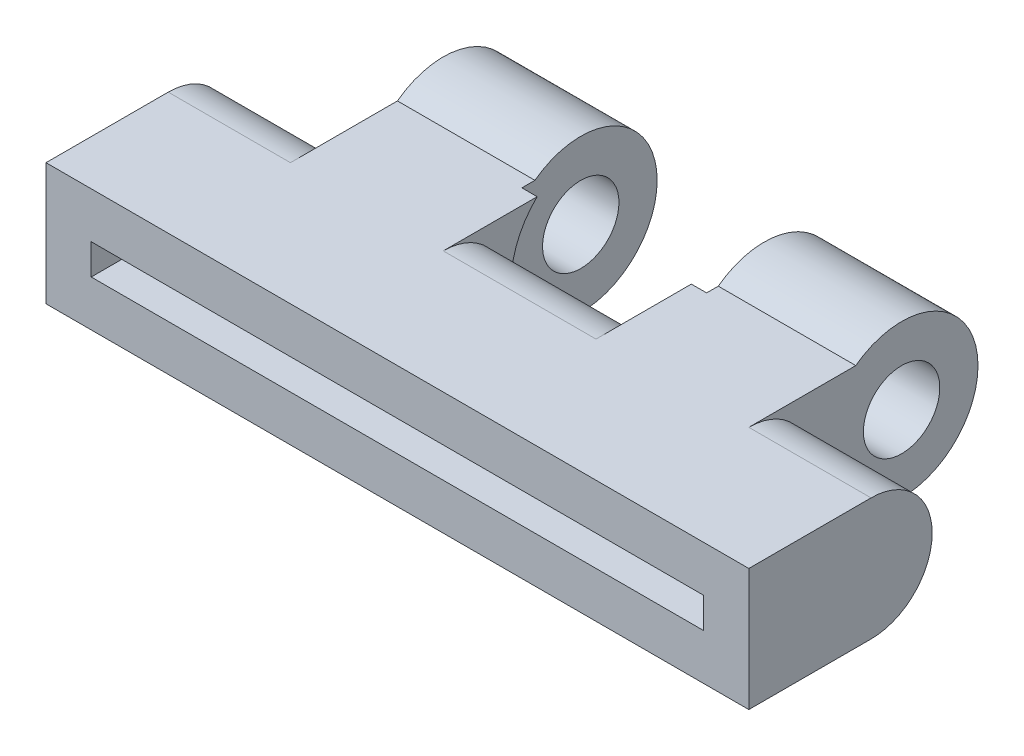
ISO-10303-21;
HEADER;
FILE_DESCRIPTION(('STEP AP214'),'2;1');
FILE_NAME('part.step','',(''),(''),'','','');
FILE_SCHEMA(('AUTOMOTIVE_DESIGN { 1 0 10303 214 1 1 1 1 }'));
ENDSEC;
DATA;
#1=APPLICATION_CONTEXT('core data for automotive mechanical design processes');
#2=APPLICATION_PROTOCOL_DEFINITION('international standard','automotive_design',2000,#1);
#3=PRODUCT_CONTEXT('',#1,'mechanical');
#4=PRODUCT('Part','Part','',(#3));
#5=PRODUCT_RELATED_PRODUCT_CATEGORY('part','',(#4));
#6=PRODUCT_DEFINITION_FORMATION('','',#4);
#7=PRODUCT_DEFINITION_CONTEXT('part definition',#1,'design');
#8=PRODUCT_DEFINITION('design','',#6,#7);
#9=PRODUCT_DEFINITION_SHAPE('','',#8);
#10=(LENGTH_UNIT() NAMED_UNIT(*) SI_UNIT(.MILLI.,.METRE.));
#11=(NAMED_UNIT(*) PLANE_ANGLE_UNIT() SI_UNIT($,.RADIAN.));
#12=(NAMED_UNIT(*) SI_UNIT($,.STERADIAN.) SOLID_ANGLE_UNIT());
#13=UNCERTAINTY_MEASURE_WITH_UNIT(LENGTH_MEASURE(1.E-05),#10,'distance_accuracy_value','');
#14=(GEOMETRIC_REPRESENTATION_CONTEXT(3) GLOBAL_UNCERTAINTY_ASSIGNED_CONTEXT((#13)) GLOBAL_UNIT_ASSIGNED_CONTEXT((#10,
#11,#12)) REPRESENTATION_CONTEXT('',''));
#15=CARTESIAN_POINT('',(0.,0.,0.));
#16=DIRECTION('',(0.,0.,1.));
#17=DIRECTION('',(1.,0.,0.));
#18=AXIS2_PLACEMENT_3D('',#15,#16,#17);
#19=CARTESIAN_POINT('',(190.,20.,-10.));
#20=DIRECTION('',(-1.,0.,0.));
#21=DIRECTION('',(0.,0.,1.));
#22=AXIS2_PLACEMENT_3D('',#19,#20,#21);
#23=CYLINDRICAL_SURFACE('',#22,25.);
#24=CARTESIAN_POINT('',(145.,20.,-10.));
#25=DIRECTION('',(-1.,0.,0.));
#26=DIRECTION('',(0.,0.,1.));
#27=AXIS2_PLACEMENT_3D('',#24,#25,#26);
#28=CIRCLE('',#27,25.);
#29=CARTESIAN_POINT('',(145.,40.,5.00000000000002));
#30=VERTEX_POINT('',#29);
#31=CARTESIAN_POINT('',(145.,0.,5.00000000000002));
#32=VERTEX_POINT('',#31);
#33=EDGE_CURVE('E470',#30,#32,#28,.T.);
#34=ORIENTED_EDGE('',*,*,#33,.F.);
#35=DIRECTION('',(-1.,0.,0.));
#36=VECTOR('',#35,1.);
#37=CARTESIAN_POINT('',(190.,40.,5.00000000000002));
#38=LINE('',#37,#36);
#39=CARTESIAN_POINT('',(190.,40.,5.00000000000002));
#40=VERTEX_POINT('',#39);
#41=EDGE_CURVE('E322',#30,#40,#38,.F.);
#42=ORIENTED_EDGE('',*,*,#41,.T.);
#43=CARTESIAN_POINT('',(190.,20.,-10.));
#44=DIRECTION('',(1.,0.,0.));
#45=DIRECTION('',(0.,0.,-1.));
#46=AXIS2_PLACEMENT_3D('',#43,#44,#45);
#47=CIRCLE('',#46,25.);
#48=CARTESIAN_POINT('',(190.,0.,5.00000000000002));
#49=VERTEX_POINT('',#48);
#50=EDGE_CURVE('E241',#49,#40,#47,.T.);
#51=ORIENTED_EDGE('',*,*,#50,.F.);
#52=DIRECTION('',(-1.,0.,0.));
#53=VECTOR('',#52,1.);
#54=CARTESIAN_POINT('',(190.,0.,5.00000000000002));
#55=LINE('',#54,#53);
#56=EDGE_CURVE('E245',#49,#32,#55,.T.);
#57=ORIENTED_EDGE('',*,*,#56,.T.);
#58=EDGE_LOOP('',(#34,#42,#51,#57));
#59=FACE_BOUND('',#58,.T.);
#60=ADVANCED_FACE('F44',(#59),#23,.T.);
#61=CARTESIAN_POINT('',(190.,20.,-10.));
#62=DIRECTION('',(-1.,0.,0.));
#63=DIRECTION('',(0.,0.,1.));
#64=AXIS2_PLACEMENT_3D('',#61,#62,#63);
#65=CYLINDRICAL_SURFACE('',#64,12.5);
#66=CARTESIAN_POINT('',(190.,20.,-10.));
#67=DIRECTION('',(-1.,0.,0.));
#68=DIRECTION('',(0.,0.,1.));
#69=AXIS2_PLACEMENT_3D('',#66,#67,#68);
#70=CIRCLE('',#69,12.5);
#71=CARTESIAN_POINT('',(190.,20.,2.5));
#72=VERTEX_POINT('',#71);
#73=EDGE_CURVE('E232',#72,#72,#70,.T.);
#74=ORIENTED_EDGE('',*,*,#73,.F.);
#75=EDGE_LOOP('',(#74));
#76=FACE_BOUND('',#75,.T.);
#77=CARTESIAN_POINT('',(145.,20.,-10.));
#78=DIRECTION('',(-1.,0.,0.));
#79=DIRECTION('',(0.,0.,1.));
#80=AXIS2_PLACEMENT_3D('',#77,#78,#79);
#81=CIRCLE('',#80,12.5);
#82=CARTESIAN_POINT('',(145.,20.,2.5));
#83=VERTEX_POINT('',#82);
#84=EDGE_CURVE('E48',#83,#83,#81,.F.);
#85=ORIENTED_EDGE('',*,*,#84,.F.);
#86=EDGE_LOOP('',(#85));
#87=FACE_BOUND('',#86,.T.);
#88=ADVANCED_FACE('F482',(#76,#87),#65,.F.);
#89=CARTESIAN_POINT('',(40.,20.,-10.));
#90=DIRECTION('',(1.,0.,0.));
#91=DIRECTION('',(0.,0.,-1.));
#92=AXIS2_PLACEMENT_3D('',#89,#90,#91);
#93=CYLINDRICAL_SURFACE('',#92,25.);
#94=DIRECTION('',(1.,0.,0.));
#95=VECTOR('',#94,1.);
#96=CARTESIAN_POINT('',(40.,40.,5.00000000000002));
#97=LINE('',#96,#95);
#98=CARTESIAN_POINT('',(85.,40.,5.00000000000002));
#99=VERTEX_POINT('',#98);
#100=CARTESIAN_POINT('',(40.,40.,5.00000000000002));
#101=VERTEX_POINT('',#100);
#102=EDGE_CURVE('E325',#99,#101,#97,.F.);
#103=ORIENTED_EDGE('',*,*,#102,.F.);
#104=CARTESIAN_POINT('',(85.,20.,-10.));
#105=DIRECTION('',(1.,0.,0.));
#106=DIRECTION('',(0.,0.,-1.));
#107=AXIS2_PLACEMENT_3D('',#104,#105,#106);
#108=CIRCLE('',#107,25.);
#109=CARTESIAN_POINT('',(85.,0.,5.00000000000002));
#110=VERTEX_POINT('',#109);
#111=EDGE_CURVE('E400',#99,#110,#108,.F.);
#112=ORIENTED_EDGE('',*,*,#111,.T.);
#113=DIRECTION('',(1.,0.,0.));
#114=VECTOR('',#113,1.);
#115=CARTESIAN_POINT('',(40.,0.,5.00000000000002));
#116=LINE('',#115,#114);
#117=CARTESIAN_POINT('',(40.,0.,5.00000000000002));
#118=VERTEX_POINT('',#117);
#119=EDGE_CURVE('E449',#118,#110,#116,.T.);
#120=ORIENTED_EDGE('',*,*,#119,.F.);
#121=CARTESIAN_POINT('',(40.,20.,-10.));
#122=DIRECTION('',(1.,0.,0.));
#123=DIRECTION('',(0.,0.,-1.));
#124=AXIS2_PLACEMENT_3D('',#121,#122,#123);
#125=CIRCLE('',#124,25.);
#126=EDGE_CURVE('E445',#118,#101,#125,.T.);
#127=ORIENTED_EDGE('',*,*,#126,.T.);
#128=EDGE_LOOP('',(#103,#112,#120,#127));
#129=FACE_BOUND('',#128,.T.);
#130=ADVANCED_FACE('F484',(#129),#93,.T.);
#131=CARTESIAN_POINT('',(40.,20.,-10.));
#132=DIRECTION('',(1.,0.,0.));
#133=DIRECTION('',(0.,0.,-1.));
#134=AXIS2_PLACEMENT_3D('',#131,#132,#133);
#135=CYLINDRICAL_SURFACE('',#134,12.5);
#136=CARTESIAN_POINT('',(40.,20.,-10.));
#137=DIRECTION('',(-1.,0.,0.));
#138=DIRECTION('',(0.,0.,1.));
#139=AXIS2_PLACEMENT_3D('',#136,#137,#138);
#140=CIRCLE('',#139,12.5);
#141=CARTESIAN_POINT('',(40.,20.,2.5));
#142=VERTEX_POINT('',#141);
#143=EDGE_CURVE('E441',#142,#142,#140,.T.);
#144=ORIENTED_EDGE('',*,*,#143,.T.);
#145=EDGE_LOOP('',(#144));
#146=FACE_BOUND('',#145,.T.);
#147=CARTESIAN_POINT('',(85.,20.,-10.));
#148=DIRECTION('',(1.,0.,0.));
#149=DIRECTION('',(0.,0.,-1.));
#150=AXIS2_PLACEMENT_3D('',#147,#148,#149);
#151=CIRCLE('',#150,12.5);
#152=CARTESIAN_POINT('',(85.,20.,-22.5));
#153=VERTEX_POINT('',#152);
#154=EDGE_CURVE('E397',#153,#153,#151,.T.);
#155=ORIENTED_EDGE('',*,*,#154,.T.);
#156=EDGE_LOOP('',(#155));
#157=FACE_BOUND('',#156,.T.);
#158=ADVANCED_FACE('F492',(#146,#157),#135,.F.);
#159=CARTESIAN_POINT('',(0.,0.,80.));
#160=DIRECTION('',(0.,1.,0.));
#161=DIRECTION('',(0.,0.,1.));
#162=AXIS2_PLACEMENT_3D('',#159,#160,#161);
#163=PLANE('',#162);
#164=DIRECTION('',(0.,0.,1.));
#165=VECTOR('',#164,1.);
#166=CARTESIAN_POINT('',(140.,0.,80.));
#167=LINE('',#166,#165);
#168=CARTESIAN_POINT('',(140.,0.,8.67145380723974));
#169=VERTEX_POINT('',#168);
#170=CARTESIAN_POINT('',(140.,0.,40.));
#171=VERTEX_POINT('',#170);
#172=EDGE_CURVE('E227',#169,#171,#167,.T.);
#173=ORIENTED_EDGE('',*,*,#172,.F.);
#174=DIRECTION('',(-1.,0.,0.));
#175=VECTOR('',#174,1.);
#176=CARTESIAN_POINT('',(145.,0.,8.67145380723974));
#177=LINE('',#176,#175);
#178=CARTESIAN_POINT('',(145.,0.,8.67145380723974));
#179=VERTEX_POINT('',#178);
#180=EDGE_CURVE('E62',#169,#179,#177,.F.);
#181=ORIENTED_EDGE('',*,*,#180,.T.);
#182=DIRECTION('',(0.,0.,1.));
#183=VECTOR('',#182,1.);
#184=CARTESIAN_POINT('',(145.,0.,80.));
#185=LINE('',#184,#183);
#186=EDGE_CURVE('E220',#32,#179,#185,.T.);
#187=ORIENTED_EDGE('',*,*,#186,.F.);
#188=ORIENTED_EDGE('',*,*,#56,.F.);
#189=DIRECTION('',(0.,0.,-1.));
#190=VECTOR('',#189,1.);
#191=CARTESIAN_POINT('',(190.,0.,80.));
#192=LINE('',#191,#190);
#193=CARTESIAN_POINT('',(190.,0.,40.));
#194=VERTEX_POINT('',#193);
#195=EDGE_CURVE('E234',#194,#49,#192,.T.);
#196=ORIENTED_EDGE('',*,*,#195,.F.);
#197=DIRECTION('',(1.,0.,0.));
#198=VECTOR('',#197,1.);
#199=CARTESIAN_POINT('',(0.,0.,40.));
#200=LINE('',#199,#198);
#201=CARTESIAN_POINT('',(230.,0.,40.));
#202=VERTEX_POINT('',#201);
#203=EDGE_CURVE('E363',#194,#202,#200,.T.);
#204=ORIENTED_EDGE('',*,*,#203,.T.);
#205=DIRECTION('',(0.,0.,-1.));
#206=VECTOR('',#205,1.);
#207=CARTESIAN_POINT('',(230.,0.,80.));
#208=LINE('',#207,#206);
#209=CARTESIAN_POINT('',(230.,0.,80.));
#210=VERTEX_POINT('',#209);
#211=EDGE_CURVE('E314',#210,#202,#208,.T.);
#212=ORIENTED_EDGE('',*,*,#211,.F.);
#213=DIRECTION('',(1.,0.,0.));
#214=VECTOR('',#213,1.);
#215=CARTESIAN_POINT('',(0.,0.,80.));
#216=LINE('',#215,#214);
#217=CARTESIAN_POINT('',(0.,0.,80.));
#218=VERTEX_POINT('',#217);
#219=EDGE_CURVE('E297',#218,#210,#216,.T.);
#220=ORIENTED_EDGE('',*,*,#219,.F.);
#221=DIRECTION('',(0.,0.,-1.));
#222=VECTOR('',#221,1.);
#223=CARTESIAN_POINT('',(0.,0.,80.));
#224=LINE('',#223,#222);
#225=CARTESIAN_POINT('',(0.,0.,40.));
#226=VERTEX_POINT('',#225);
#227=EDGE_CURVE('E318',#218,#226,#224,.T.);
#228=ORIENTED_EDGE('',*,*,#227,.T.);
#229=DIRECTION('',(1.,0.,0.));
#230=VECTOR('',#229,1.);
#231=CARTESIAN_POINT('',(0.,0.,40.));
#232=LINE('',#231,#230);
#233=CARTESIAN_POINT('',(40.,0.,40.));
#234=VERTEX_POINT('',#233);
#235=EDGE_CURVE('E387',#226,#234,#232,.T.);
#236=ORIENTED_EDGE('',*,*,#235,.T.);
#237=DIRECTION('',(0.,0.,1.));
#238=VECTOR('',#237,1.);
#239=CARTESIAN_POINT('',(40.,0.,80.));
#240=LINE('',#239,#238);
#241=EDGE_CURVE('E431',#118,#234,#240,.T.);
#242=ORIENTED_EDGE('',*,*,#241,.F.);
#243=ORIENTED_EDGE('',*,*,#119,.T.);
#244=DIRECTION('',(0.,0.,-1.));
#245=VECTOR('',#244,1.);
#246=CARTESIAN_POINT('',(85.,0.,80.));
#247=LINE('',#246,#245);
#248=CARTESIAN_POINT('',(85.,0.,9.26757016417817));
#249=VERTEX_POINT('',#248);
#250=EDGE_CURVE('E420',#249,#110,#247,.T.);
#251=ORIENTED_EDGE('',*,*,#250,.F.);
#252=DIRECTION('',(1.,0.,0.));
#253=VECTOR('',#252,1.);
#254=CARTESIAN_POINT('',(85.,0.,9.26757016417817));
#255=LINE('',#254,#253);
#256=CARTESIAN_POINT('',(90.,0.,9.26757016417817));
#257=VERTEX_POINT('',#256);
#258=EDGE_CURVE('E396',#249,#257,#255,.T.);
#259=ORIENTED_EDGE('',*,*,#258,.T.);
#260=DIRECTION('',(0.,0.,-1.));
#261=VECTOR('',#260,1.);
#262=CARTESIAN_POINT('',(90.,0.,80.));
#263=LINE('',#262,#261);
#264=CARTESIAN_POINT('',(90.,0.,40.));
#265=VERTEX_POINT('',#264);
#266=EDGE_CURVE('E434',#265,#257,#263,.T.);
#267=ORIENTED_EDGE('',*,*,#266,.F.);
#268=DIRECTION('',(-1.,0.,0.));
#269=VECTOR('',#268,1.);
#270=CARTESIAN_POINT('',(140.,0.,40.));
#271=LINE('',#270,#269);
#272=EDGE_CURVE('E331',#265,#171,#271,.F.);
#273=ORIENTED_EDGE('',*,*,#272,.T.);
#274=EDGE_LOOP('',(#173,#181,#187,#188,#196,#204,#212,#220,#228,#236,#242,#243,#251,#259,#267,#273));
#275=FACE_BOUND('',#274,.T.);
#276=ADVANCED_FACE('F465',(#275),#163,.F.);
#277=CARTESIAN_POINT('',(0.,40.,80.));
#278=DIRECTION('',(0.,-1.,0.));
#279=DIRECTION('',(0.,0.,-1.));
#280=AXIS2_PLACEMENT_3D('',#277,#278,#279);
#281=PLANE('',#280);
#282=DIRECTION('',(0.,0.,-1.));
#283=VECTOR('',#282,1.);
#284=CARTESIAN_POINT('',(145.,40.,80.));
#285=LINE('',#284,#283);
#286=CARTESIAN_POINT('',(145.,40.,8.81209296246682));
#287=VERTEX_POINT('',#286);
#288=EDGE_CURVE('E218',#287,#30,#285,.T.);
#289=ORIENTED_EDGE('',*,*,#288,.F.);
#290=DIRECTION('',(-1.,0.,0.));
#291=VECTOR('',#290,1.);
#292=CARTESIAN_POINT('',(145.,40.,8.81209296246682));
#293=LINE('',#292,#291);
#294=CARTESIAN_POINT('',(140.,40.,8.81209296246682));
#295=VERTEX_POINT('',#294);
#296=EDGE_CURVE('E203',#287,#295,#293,.T.);
#297=ORIENTED_EDGE('',*,*,#296,.T.);
#298=DIRECTION('',(0.,0.,-1.));
#299=VECTOR('',#298,1.);
#300=CARTESIAN_POINT('',(140.,40.,80.));
#301=LINE('',#300,#299);
#302=CARTESIAN_POINT('',(140.,40.,40.));
#303=VERTEX_POINT('',#302);
#304=EDGE_CURVE('E215',#303,#295,#301,.T.);
#305=ORIENTED_EDGE('',*,*,#304,.F.);
#306=DIRECTION('',(-1.,0.,0.));
#307=VECTOR('',#306,1.);
#308=CARTESIAN_POINT('',(90.,40.,40.));
#309=LINE('',#308,#307);
#310=CARTESIAN_POINT('',(90.,40.,40.));
#311=VERTEX_POINT('',#310);
#312=EDGE_CURVE('E328',#303,#311,#309,.T.);
#313=ORIENTED_EDGE('',*,*,#312,.T.);
#314=DIRECTION('',(0.,0.,1.));
#315=VECTOR('',#314,1.);
#316=CARTESIAN_POINT('',(90.,40.,80.));
#317=LINE('',#316,#315);
#318=CARTESIAN_POINT('',(90.,40.,9.26757016417817));
#319=VERTEX_POINT('',#318);
#320=EDGE_CURVE('E438',#319,#311,#317,.T.);
#321=ORIENTED_EDGE('',*,*,#320,.F.);
#322=DIRECTION('',(1.,0.,0.));
#323=VECTOR('',#322,1.);
#324=CARTESIAN_POINT('',(85.,40.,9.26757016417817));
#325=LINE('',#324,#323);
#326=CARTESIAN_POINT('',(85.,40.,9.26757016417817));
#327=VERTEX_POINT('',#326);
#328=EDGE_CURVE('E70',#319,#327,#325,.F.);
#329=ORIENTED_EDGE('',*,*,#328,.T.);
#330=DIRECTION('',(0.,0.,1.));
#331=VECTOR('',#330,1.);
#332=CARTESIAN_POINT('',(85.,40.,80.));
#333=LINE('',#332,#331);
#334=EDGE_CURVE('E407',#99,#327,#333,.T.);
#335=ORIENTED_EDGE('',*,*,#334,.F.);
#336=ORIENTED_EDGE('',*,*,#102,.T.);
#337=DIRECTION('',(0.,0.,-1.));
#338=VECTOR('',#337,1.);
#339=CARTESIAN_POINT('',(40.,40.,80.));
#340=LINE('',#339,#338);
#341=CARTESIAN_POINT('',(40.,40.,40.));
#342=VERTEX_POINT('',#341);
#343=EDGE_CURVE('E352',#342,#101,#340,.T.);
#344=ORIENTED_EDGE('',*,*,#343,.F.);
#345=DIRECTION('',(1.,0.,0.));
#346=VECTOR('',#345,1.);
#347=CARTESIAN_POINT('',(0.,40.,40.));
#348=LINE('',#347,#346);
#349=CARTESIAN_POINT('',(0.,40.,40.));
#350=VERTEX_POINT('',#349);
#351=EDGE_CURVE('E373',#342,#350,#348,.F.);
#352=ORIENTED_EDGE('',*,*,#351,.T.);
#353=DIRECTION('',(0.,0.,-1.));
#354=VECTOR('',#353,1.);
#355=CARTESIAN_POINT('',(0.,40.,80.));
#356=LINE('',#355,#354);
#357=CARTESIAN_POINT('',(0.,40.,80.));
#358=VERTEX_POINT('',#357);
#359=EDGE_CURVE('E306',#358,#350,#356,.T.);
#360=ORIENTED_EDGE('',*,*,#359,.F.);
#361=DIRECTION('',(-1.,0.,0.));
#362=VECTOR('',#361,1.);
#363=CARTESIAN_POINT('',(0.,40.,80.));
#364=LINE('',#363,#362);
#365=CARTESIAN_POINT('',(230.,40.,80.));
#366=VERTEX_POINT('',#365);
#367=EDGE_CURVE('E303',#366,#358,#364,.T.);
#368=ORIENTED_EDGE('',*,*,#367,.F.);
#369=DIRECTION('',(0.,0.,-1.));
#370=VECTOR('',#369,1.);
#371=CARTESIAN_POINT('',(230.,40.,80.));
#372=LINE('',#371,#370);
#373=CARTESIAN_POINT('',(230.,40.,40.));
#374=VERTEX_POINT('',#373);
#375=EDGE_CURVE('E310',#366,#374,#372,.T.);
#376=ORIENTED_EDGE('',*,*,#375,.T.);
#377=DIRECTION('',(1.,0.,0.));
#378=VECTOR('',#377,1.);
#379=CARTESIAN_POINT('',(0.,40.,40.));
#380=LINE('',#379,#378);
#381=CARTESIAN_POINT('',(190.,40.,40.));
#382=VERTEX_POINT('',#381);
#383=EDGE_CURVE('E359',#374,#382,#380,.F.);
#384=ORIENTED_EDGE('',*,*,#383,.T.);
#385=DIRECTION('',(0.,0.,1.));
#386=VECTOR('',#385,1.);
#387=CARTESIAN_POINT('',(190.,40.,80.));
#388=LINE('',#387,#386);
#389=EDGE_CURVE('E228',#40,#382,#388,.T.);
#390=ORIENTED_EDGE('',*,*,#389,.F.);
#391=ORIENTED_EDGE('',*,*,#41,.F.);
#392=EDGE_LOOP('',(#289,#297,#305,#313,#321,#329,#335,#336,#344,#352,#360,#368,#376,#384,#390,#391));
#393=FACE_BOUND('',#392,.T.);
#394=ADVANCED_FACE('F213',(#393),#281,.F.);
#395=CARTESIAN_POINT('',(0.,0.,80.));
#396=DIRECTION('',(1.,0.,0.));
#397=DIRECTION('',(0.,0.,-1.));
#398=AXIS2_PLACEMENT_3D('',#395,#396,#397);
#399=PLANE('',#398);
#400=ORIENTED_EDGE('',*,*,#359,.T.);
#401=CARTESIAN_POINT('',(0.,20.,40.));
#402=DIRECTION('',(1.,0.,0.));
#403=DIRECTION('',(0.,0.,-1.));
#404=AXIS2_PLACEMENT_3D('',#401,#402,#403);
#405=CIRCLE('',#404,20.);
#406=CARTESIAN_POINT('',(0.,20.,20.));
#407=VERTEX_POINT('',#406);
#408=EDGE_CURVE('E384',#350,#407,#405,.F.);
#409=ORIENTED_EDGE('',*,*,#408,.T.);
#410=CARTESIAN_POINT('',(0.,20.,40.));
#411=DIRECTION('',(1.,0.,0.));
#412=DIRECTION('',(0.,0.,-1.));
#413=AXIS2_PLACEMENT_3D('',#410,#411,#412);
#414=CIRCLE('',#413,20.);
#415=EDGE_CURVE('E381',#407,#226,#414,.F.);
#416=ORIENTED_EDGE('',*,*,#415,.T.);
#417=ORIENTED_EDGE('',*,*,#227,.F.);
#418=DIRECTION('',(0.,-1.,0.));
#419=VECTOR('',#418,1.);
#420=CARTESIAN_POINT('',(0.,0.,80.));
#421=LINE('',#420,#419);
#422=EDGE_CURVE('E284',#358,#218,#421,.T.);
#423=ORIENTED_EDGE('',*,*,#422,.F.);
#424=EDGE_LOOP('',(#400,#409,#416,#417,#423));
#425=FACE_BOUND('',#424,.T.);
#426=ADVANCED_FACE('F531',(#425),#399,.F.);
#427=CARTESIAN_POINT('',(230.,0.,80.));
#428=DIRECTION('',(-1.,0.,0.));
#429=DIRECTION('',(0.,0.,1.));
#430=AXIS2_PLACEMENT_3D('',#427,#428,#429);
#431=PLANE('',#430);
#432=CARTESIAN_POINT('',(230.,20.,40.));
#433=DIRECTION('',(-1.,0.,0.));
#434=DIRECTION('',(0.,0.,1.));
#435=AXIS2_PLACEMENT_3D('',#432,#433,#434);
#436=CIRCLE('',#435,20.);
#437=CARTESIAN_POINT('',(230.,20.,20.));
#438=VERTEX_POINT('',#437);
#439=EDGE_CURVE('E347',#202,#438,#436,.F.);
#440=ORIENTED_EDGE('',*,*,#439,.T.);
#441=CARTESIAN_POINT('',(230.,20.,40.));
#442=DIRECTION('',(-1.,0.,0.));
#443=DIRECTION('',(0.,0.,1.));
#444=AXIS2_PLACEMENT_3D('',#441,#442,#443);
#445=CIRCLE('',#444,20.);
#446=EDGE_CURVE('E356',#438,#374,#445,.F.);
#447=ORIENTED_EDGE('',*,*,#446,.T.);
#448=ORIENTED_EDGE('',*,*,#375,.F.);
#449=DIRECTION('',(0.,1.,0.));
#450=VECTOR('',#449,1.);
#451=CARTESIAN_POINT('',(230.,0.,80.));
#452=LINE('',#451,#450);
#453=EDGE_CURVE('E300',#210,#366,#452,.T.);
#454=ORIENTED_EDGE('',*,*,#453,.F.);
#455=ORIENTED_EDGE('',*,*,#211,.T.);
#456=EDGE_LOOP('',(#440,#447,#448,#454,#455));
#457=FACE_BOUND('',#456,.T.);
#458=ADVANCED_FACE('F527',(#457),#431,.F.);
#459=CARTESIAN_POINT('',(0.,0.,80.));
#460=DIRECTION('',(0.,0.,-1.));
#461=DIRECTION('',(-1.,0.,0.));
#462=AXIS2_PLACEMENT_3D('',#459,#460,#461);
#463=PLANE('',#462);
#464=DIRECTION('',(-1.,0.,0.));
#465=VECTOR('',#464,1.);
#466=CARTESIAN_POINT('',(14.8,25.,80.));
#467=LINE('',#466,#465);
#468=CARTESIAN_POINT('',(215.2,25.,80.));
#469=VERTEX_POINT('',#468);
#470=CARTESIAN_POINT('',(14.8,25.,80.));
#471=VERTEX_POINT('',#470);
#472=EDGE_CURVE('E270',#469,#471,#467,.T.);
#473=ORIENTED_EDGE('',*,*,#472,.F.);
#474=DIRECTION('',(0.,1.,0.));
#475=VECTOR('',#474,1.);
#476=CARTESIAN_POINT('',(215.2,25.,80.));
#477=LINE('',#476,#475);
#478=CARTESIAN_POINT('',(215.2,15.,80.));
#479=VERTEX_POINT('',#478);
#480=EDGE_CURVE('E249',#479,#469,#477,.T.);
#481=ORIENTED_EDGE('',*,*,#480,.F.);
#482=DIRECTION('',(1.,0.,0.));
#483=VECTOR('',#482,1.);
#484=CARTESIAN_POINT('',(14.8,15.,80.));
#485=LINE('',#484,#483);
#486=CARTESIAN_POINT('',(14.8,15.,80.));
#487=VERTEX_POINT('',#486);
#488=EDGE_CURVE('E255',#487,#479,#485,.T.);
#489=ORIENTED_EDGE('',*,*,#488,.F.);
#490=DIRECTION('',(0.,-1.,0.));
#491=VECTOR('',#490,1.);
#492=CARTESIAN_POINT('',(14.8,25.,80.));
#493=LINE('',#492,#491);
#494=EDGE_CURVE('E274',#471,#487,#493,.T.);
#495=ORIENTED_EDGE('',*,*,#494,.F.);
#496=EDGE_LOOP('',(#473,#481,#489,#495));
#497=FACE_BOUND('',#496,.T.);
#498=ORIENTED_EDGE('',*,*,#422,.T.);
#499=ORIENTED_EDGE('',*,*,#219,.T.);
#500=ORIENTED_EDGE('',*,*,#453,.T.);
#501=ORIENTED_EDGE('',*,*,#367,.T.);
#502=EDGE_LOOP('',(#498,#499,#500,#501));
#503=FACE_BOUND('',#502,.T.);
#504=ADVANCED_FACE('F523',(#497,#503),#463,.F.);
#505=CARTESIAN_POINT('',(215.2,25.,50.));
#506=DIRECTION('',(1.,0.,0.));
#507=DIRECTION('',(0.,0.,-1.));
#508=AXIS2_PLACEMENT_3D('',#505,#506,#507);
#509=PLANE('',#508);
#510=ORIENTED_EDGE('',*,*,#480,.T.);
#511=DIRECTION('',(0.,0.,1.));
#512=VECTOR('',#511,1.);
#513=CARTESIAN_POINT('',(215.2,25.,50.));
#514=LINE('',#513,#512);
#515=CARTESIAN_POINT('',(215.2,25.,50.));
#516=VERTEX_POINT('',#515);
#517=EDGE_CURVE('E267',#516,#469,#514,.T.);
#518=ORIENTED_EDGE('',*,*,#517,.F.);
#519=DIRECTION('',(0.,1.,0.));
#520=VECTOR('',#519,1.);
#521=CARTESIAN_POINT('',(215.2,25.,50.));
#522=LINE('',#521,#520);
#523=CARTESIAN_POINT('',(215.2,15.,50.));
#524=VERTEX_POINT('',#523);
#525=EDGE_CURVE('E250',#524,#516,#522,.T.);
#526=ORIENTED_EDGE('',*,*,#525,.F.);
#527=DIRECTION('',(0.,0.,1.));
#528=VECTOR('',#527,1.);
#529=CARTESIAN_POINT('',(215.2,15.,50.));
#530=LINE('',#529,#528);
#531=EDGE_CURVE('E281',#524,#479,#530,.T.);
#532=ORIENTED_EDGE('',*,*,#531,.T.);
#533=EDGE_LOOP('',(#510,#518,#526,#532));
#534=FACE_BOUND('',#533,.T.);
#535=ADVANCED_FACE('F513',(#534),#509,.F.);
#536=CARTESIAN_POINT('',(14.8,15.,50.));
#537=DIRECTION('',(0.,-1.,0.));
#538=DIRECTION('',(0.,0.,-1.));
#539=AXIS2_PLACEMENT_3D('',#536,#537,#538);
#540=PLANE('',#539);
#541=ORIENTED_EDGE('',*,*,#488,.T.);
#542=ORIENTED_EDGE('',*,*,#531,.F.);
#543=DIRECTION('',(1.,0.,0.));
#544=VECTOR('',#543,1.);
#545=CARTESIAN_POINT('',(14.8,15.,50.));
#546=LINE('',#545,#544);
#547=CARTESIAN_POINT('',(14.8,15.,50.));
#548=VERTEX_POINT('',#547);
#549=EDGE_CURVE('E263',#548,#524,#546,.T.);
#550=ORIENTED_EDGE('',*,*,#549,.F.);
#551=DIRECTION('',(0.,0.,1.));
#552=VECTOR('',#551,1.);
#553=CARTESIAN_POINT('',(14.8,15.,50.));
#554=LINE('',#553,#552);
#555=EDGE_CURVE('E285',#548,#487,#554,.T.);
#556=ORIENTED_EDGE('',*,*,#555,.T.);
#557=EDGE_LOOP('',(#541,#542,#550,#556));
#558=FACE_BOUND('',#557,.T.);
#559=ADVANCED_FACE('F509',(#558),#540,.F.);
#560=CARTESIAN_POINT('',(14.8,25.,50.));
#561=DIRECTION('',(-1.,0.,0.));
#562=DIRECTION('',(0.,-1.,0.));
#563=AXIS2_PLACEMENT_3D('',#560,#561,#562);
#564=PLANE('',#563);
#565=ORIENTED_EDGE('',*,*,#494,.T.);
#566=ORIENTED_EDGE('',*,*,#555,.F.);
#567=DIRECTION('',(0.,-1.,0.));
#568=VECTOR('',#567,1.);
#569=CARTESIAN_POINT('',(14.8,25.,50.));
#570=LINE('',#569,#568);
#571=CARTESIAN_POINT('',(14.8,25.,50.));
#572=VERTEX_POINT('',#571);
#573=EDGE_CURVE('E259',#572,#548,#570,.T.);
#574=ORIENTED_EDGE('',*,*,#573,.F.);
#575=DIRECTION('',(0.,0.,1.));
#576=VECTOR('',#575,1.);
#577=CARTESIAN_POINT('',(14.8,25.,50.));
#578=LINE('',#577,#576);
#579=EDGE_CURVE('E288',#572,#471,#578,.T.);
#580=ORIENTED_EDGE('',*,*,#579,.T.);
#581=EDGE_LOOP('',(#565,#566,#574,#580));
#582=FACE_BOUND('',#581,.T.);
#583=ADVANCED_FACE('F512',(#582),#564,.F.);
#584=CARTESIAN_POINT('',(14.8,25.,50.));
#585=DIRECTION('',(0.,1.,0.));
#586=DIRECTION('',(0.,0.,1.));
#587=AXIS2_PLACEMENT_3D('',#584,#585,#586);
#588=PLANE('',#587);
#589=ORIENTED_EDGE('',*,*,#472,.T.);
#590=ORIENTED_EDGE('',*,*,#579,.F.);
#591=DIRECTION('',(-1.,0.,0.));
#592=VECTOR('',#591,1.);
#593=CARTESIAN_POINT('',(14.8,25.,50.));
#594=LINE('',#593,#592);
#595=EDGE_CURVE('E254',#516,#572,#594,.T.);
#596=ORIENTED_EDGE('',*,*,#595,.F.);
#597=ORIENTED_EDGE('',*,*,#517,.T.);
#598=EDGE_LOOP('',(#589,#590,#596,#597));
#599=FACE_BOUND('',#598,.T.);
#600=ADVANCED_FACE('F507',(#599),#588,.F.);
#601=CARTESIAN_POINT('',(0.,0.,50.));
#602=DIRECTION('',(0.,0.,1.));
#603=DIRECTION('',(1.,0.,0.));
#604=AXIS2_PLACEMENT_3D('',#601,#602,#603);
#605=PLANE('',#604);
#606=ORIENTED_EDGE('',*,*,#525,.T.);
#607=ORIENTED_EDGE('',*,*,#595,.T.);
#608=ORIENTED_EDGE('',*,*,#573,.T.);
#609=ORIENTED_EDGE('',*,*,#549,.T.);
#610=EDGE_LOOP('',(#606,#607,#608,#609));
#611=FACE_BOUND('',#610,.T.);
#612=ADVANCED_FACE('F501',(#611),#605,.T.);
#613=CARTESIAN_POINT('',(190.,20.,-10.));
#614=DIRECTION('',(1.,0.,0.));
#615=DIRECTION('',(0.,0.,-1.));
#616=AXIS2_PLACEMENT_3D('',#613,#614,#615);
#617=PLANE('',#616);
#618=ORIENTED_EDGE('',*,*,#389,.T.);
#619=CARTESIAN_POINT('',(190.,20.,40.));
#620=DIRECTION('',(1.,0.,0.));
#621=DIRECTION('',(0.,0.,-1.));
#622=AXIS2_PLACEMENT_3D('',#619,#620,#621);
#623=CIRCLE('',#622,20.);
#624=CARTESIAN_POINT('',(190.,20.,20.));
#625=VERTEX_POINT('',#624);
#626=EDGE_CURVE('E366',#382,#625,#623,.F.);
#627=ORIENTED_EDGE('',*,*,#626,.T.);
#628=CARTESIAN_POINT('',(190.,20.,40.));
#629=DIRECTION('',(1.,0.,0.));
#630=DIRECTION('',(0.,0.,-1.));
#631=AXIS2_PLACEMENT_3D('',#628,#629,#630);
#632=CIRCLE('',#631,20.);
#633=EDGE_CURVE('E369',#625,#194,#632,.F.);
#634=ORIENTED_EDGE('',*,*,#633,.T.);
#635=ORIENTED_EDGE('',*,*,#195,.T.);
#636=ORIENTED_EDGE('',*,*,#50,.T.);
#637=EDGE_LOOP('',(#618,#627,#634,#635,#636));
#638=FACE_BOUND('',#637,.T.);
#639=ORIENTED_EDGE('',*,*,#73,.T.);
#640=EDGE_LOOP('',(#639));
#641=FACE_BOUND('',#640,.T.);
#642=ADVANCED_FACE('F455',(#638,#641),#617,.T.);
#643=CARTESIAN_POINT('',(140.,20.,-10.));
#644=DIRECTION('',(1.,0.,0.));
#645=DIRECTION('',(0.,0.,-1.));
#646=AXIS2_PLACEMENT_3D('',#643,#644,#645);
#647=PLANE('',#646);
#648=ORIENTED_EDGE('',*,*,#304,.T.);
#649=CARTESIAN_POINT('',(140.,20.067055546695,-10.329884600225));
#650=DIRECTION('',(-1.,0.,0.));
#651=DIRECTION('',(0.,0.,1.));
#652=AXIS2_PLACEMENT_3D('',#649,#650,#651);
#653=CIRCLE('',#652,27.6358024958411);
#654=EDGE_CURVE('E200',#169,#295,#653,.T.);
#655=ORIENTED_EDGE('',*,*,#654,.F.);
#656=ORIENTED_EDGE('',*,*,#172,.T.);
#657=CARTESIAN_POINT('',(140.,20.,40.));
#658=DIRECTION('',(1.,0.,0.));
#659=DIRECTION('',(0.,0.,-1.));
#660=AXIS2_PLACEMENT_3D('',#657,#658,#659);
#661=CIRCLE('',#660,20.);
#662=CARTESIAN_POINT('',(140.,20.,20.));
#663=VERTEX_POINT('',#662);
#664=EDGE_CURVE('E344',#171,#663,#661,.T.);
#665=ORIENTED_EDGE('',*,*,#664,.T.);
#666=CARTESIAN_POINT('',(140.,20.,40.));
#667=DIRECTION('',(1.,0.,0.));
#668=DIRECTION('',(0.,0.,-1.));
#669=AXIS2_PLACEMENT_3D('',#666,#667,#668);
#670=CIRCLE('',#669,20.);
#671=EDGE_CURVE('E224',#663,#303,#670,.T.);
#672=ORIENTED_EDGE('',*,*,#671,.T.);
#673=EDGE_LOOP('',(#648,#655,#656,#665,#672));
#674=FACE_BOUND('',#673,.T.);
#675=ADVANCED_FACE('F222',(#674),#647,.F.);
#676=CARTESIAN_POINT('',(40.,20.,-10.));
#677=DIRECTION('',(-1.,0.,0.));
#678=DIRECTION('',(0.,0.,-1.));
#679=AXIS2_PLACEMENT_3D('',#676,#677,#678);
#680=PLANE('',#679);
#681=ORIENTED_EDGE('',*,*,#241,.T.);
#682=CARTESIAN_POINT('',(40.,20.,40.));
#683=DIRECTION('',(-1.,0.,0.));
#684=DIRECTION('',(0.,0.,1.));
#685=AXIS2_PLACEMENT_3D('',#682,#683,#684);
#686=CIRCLE('',#685,20.);
#687=CARTESIAN_POINT('',(40.,20.,20.));
#688=VERTEX_POINT('',#687);
#689=EDGE_CURVE('E11',#234,#688,#686,.F.);
#690=ORIENTED_EDGE('',*,*,#689,.T.);
#691=CARTESIAN_POINT('',(40.,20.,40.));
#692=DIRECTION('',(-1.,0.,0.));
#693=DIRECTION('',(0.,0.,1.));
#694=AXIS2_PLACEMENT_3D('',#691,#692,#693);
#695=CIRCLE('',#694,20.);
#696=EDGE_CURVE('E54',#688,#342,#695,.F.);
#697=ORIENTED_EDGE('',*,*,#696,.T.);
#698=ORIENTED_EDGE('',*,*,#343,.T.);
#699=ORIENTED_EDGE('',*,*,#126,.F.);
#700=EDGE_LOOP('',(#681,#690,#697,#698,#699));
#701=FACE_BOUND('',#700,.T.);
#702=ORIENTED_EDGE('',*,*,#143,.F.);
#703=EDGE_LOOP('',(#702));
#704=FACE_BOUND('',#703,.T.);
#705=ADVANCED_FACE('F503',(#701,#704),#680,.T.);
#706=CARTESIAN_POINT('',(90.,20.,-10.));
#707=DIRECTION('',(-1.,0.,0.));
#708=DIRECTION('',(0.,0.,-1.));
#709=AXIS2_PLACEMENT_3D('',#706,#707,#708);
#710=PLANE('',#709);
#711=ORIENTED_EDGE('',*,*,#266,.T.);
#712=CARTESIAN_POINT('',(90.,20.,-10.));
#713=DIRECTION('',(1.,0.,0.));
#714=DIRECTION('',(0.,0.,-1.));
#715=AXIS2_PLACEMENT_3D('',#712,#713,#714);
#716=CIRCLE('',#715,27.7711947894132);
#717=EDGE_CURVE('E410',#319,#257,#716,.T.);
#718=ORIENTED_EDGE('',*,*,#717,.F.);
#719=ORIENTED_EDGE('',*,*,#320,.T.);
#720=CARTESIAN_POINT('',(90.,20.,40.));
#721=DIRECTION('',(-1.,0.,0.));
#722=DIRECTION('',(0.,0.,1.));
#723=AXIS2_PLACEMENT_3D('',#720,#721,#722);
#724=CIRCLE('',#723,20.);
#725=CARTESIAN_POINT('',(90.,20.,20.));
#726=VERTEX_POINT('',#725);
#727=EDGE_CURVE('E335',#311,#726,#724,.T.);
#728=ORIENTED_EDGE('',*,*,#727,.T.);
#729=CARTESIAN_POINT('',(90.,20.,40.));
#730=DIRECTION('',(-1.,0.,0.));
#731=DIRECTION('',(0.,0.,1.));
#732=AXIS2_PLACEMENT_3D('',#729,#730,#731);
#733=CIRCLE('',#732,20.);
#734=EDGE_CURVE('E340',#726,#265,#733,.T.);
#735=ORIENTED_EDGE('',*,*,#734,.T.);
#736=EDGE_LOOP('',(#711,#718,#719,#728,#735));
#737=FACE_BOUND('',#736,.T.);
#738=ADVANCED_FACE('F547',(#737),#710,.F.);
#739=CARTESIAN_POINT('',(140.,20.,40.));
#740=DIRECTION('',(1.,0.,0.));
#741=DIRECTION('',(0.,0.,-1.));
#742=AXIS2_PLACEMENT_3D('',#739,#740,#741);
#743=CYLINDRICAL_SURFACE('',#742,20.);
#744=DIRECTION('',(-1.,0.,0.));
#745=VECTOR('',#744,1.);
#746=CARTESIAN_POINT('',(90.,20.,20.));
#747=LINE('',#746,#745);
#748=EDGE_CURVE('E348',#663,#726,#747,.T.);
#749=ORIENTED_EDGE('',*,*,#748,.F.);
#750=ORIENTED_EDGE('',*,*,#664,.F.);
#751=ORIENTED_EDGE('',*,*,#272,.F.);
#752=ORIENTED_EDGE('',*,*,#734,.F.);
#753=EDGE_LOOP('',(#749,#750,#751,#752));
#754=FACE_BOUND('',#753,.T.);
#755=ADVANCED_FACE('F543',(#754),#743,.T.);
#756=CARTESIAN_POINT('',(0.,20.,40.));
#757=DIRECTION('',(1.,0.,0.));
#758=DIRECTION('',(0.,0.,-1.));
#759=AXIS2_PLACEMENT_3D('',#756,#757,#758);
#760=CYLINDRICAL_SURFACE('',#759,20.);
#761=ORIENTED_EDGE('',*,*,#671,.F.);
#762=ORIENTED_EDGE('',*,*,#748,.T.);
#763=ORIENTED_EDGE('',*,*,#727,.F.);
#764=ORIENTED_EDGE('',*,*,#312,.F.);
#765=EDGE_LOOP('',(#761,#762,#763,#764));
#766=FACE_BOUND('',#765,.T.);
#767=ADVANCED_FACE('F539',(#766),#760,.T.);
#768=CARTESIAN_POINT('',(0.,20.,40.));
#769=DIRECTION('',(1.,0.,0.));
#770=DIRECTION('',(0.,0.,-1.));
#771=AXIS2_PLACEMENT_3D('',#768,#769,#770);
#772=CYLINDRICAL_SURFACE('',#771,20.);
#773=ORIENTED_EDGE('',*,*,#203,.F.);
#774=ORIENTED_EDGE('',*,*,#633,.F.);
#775=DIRECTION('',(1.,0.,0.));
#776=VECTOR('',#775,1.);
#777=CARTESIAN_POINT('',(190.,20.,20.));
#778=LINE('',#777,#776);
#779=EDGE_CURVE('E353',#438,#625,#778,.F.);
#780=ORIENTED_EDGE('',*,*,#779,.F.);
#781=ORIENTED_EDGE('',*,*,#439,.F.);
#782=EDGE_LOOP('',(#773,#774,#780,#781));
#783=FACE_BOUND('',#782,.T.);
#784=ADVANCED_FACE('F542',(#783),#772,.T.);
#785=CARTESIAN_POINT('',(190.,20.,40.));
#786=DIRECTION('',(1.,0.,0.));
#787=DIRECTION('',(0.,0.,-1.));
#788=AXIS2_PLACEMENT_3D('',#785,#786,#787);
#789=CYLINDRICAL_SURFACE('',#788,20.);
#790=ORIENTED_EDGE('',*,*,#626,.F.);
#791=ORIENTED_EDGE('',*,*,#383,.F.);
#792=ORIENTED_EDGE('',*,*,#446,.F.);
#793=ORIENTED_EDGE('',*,*,#779,.T.);
#794=EDGE_LOOP('',(#790,#791,#792,#793));
#795=FACE_BOUND('',#794,.T.);
#796=ADVANCED_FACE('F549',(#795),#789,.T.);
#797=CARTESIAN_POINT('',(0.,20.,40.));
#798=DIRECTION('',(1.,0.,0.));
#799=DIRECTION('',(0.,0.,-1.));
#800=AXIS2_PLACEMENT_3D('',#797,#798,#799);
#801=CYLINDRICAL_SURFACE('',#800,20.);
#802=ORIENTED_EDGE('',*,*,#235,.F.);
#803=ORIENTED_EDGE('',*,*,#415,.F.);
#804=DIRECTION('',(1.,0.,0.));
#805=VECTOR('',#804,1.);
#806=CARTESIAN_POINT('',(-9.99999999999999,20.,20.));
#807=LINE('',#806,#805);
#808=EDGE_CURVE('E377',#688,#407,#807,.F.);
#809=ORIENTED_EDGE('',*,*,#808,.F.);
#810=ORIENTED_EDGE('',*,*,#689,.F.);
#811=EDGE_LOOP('',(#802,#803,#809,#810));
#812=FACE_BOUND('',#811,.T.);
#813=ADVANCED_FACE('F46',(#812),#801,.T.);
#814=CARTESIAN_POINT('',(-9.99999999999999,20.,40.));
#815=DIRECTION('',(1.,0.,0.));
#816=DIRECTION('',(0.,0.,-1.));
#817=AXIS2_PLACEMENT_3D('',#814,#815,#816);
#818=CYLINDRICAL_SURFACE('',#817,20.);
#819=ORIENTED_EDGE('',*,*,#408,.F.);
#820=ORIENTED_EDGE('',*,*,#351,.F.);
#821=ORIENTED_EDGE('',*,*,#696,.F.);
#822=ORIENTED_EDGE('',*,*,#808,.T.);
#823=EDGE_LOOP('',(#819,#820,#821,#822));
#824=FACE_BOUND('',#823,.T.);
#825=ADVANCED_FACE('F555',(#824),#818,.T.);
#826=CARTESIAN_POINT('',(85.,20.,-10.));
#827=DIRECTION('',(1.,0.,0.));
#828=DIRECTION('',(0.,0.,-1.));
#829=AXIS2_PLACEMENT_3D('',#826,#827,#828);
#830=CYLINDRICAL_SURFACE('',#829,27.7711947894132);
#831=CARTESIAN_POINT('',(85.,20.,-10.));
#832=DIRECTION('',(1.,0.,0.));
#833=DIRECTION('',(0.,0.,-1.));
#834=AXIS2_PLACEMENT_3D('',#831,#832,#833);
#835=CIRCLE('',#834,27.7711947894132);
#836=EDGE_CURVE('E401',#327,#249,#835,.T.);
#837=ORIENTED_EDGE('',*,*,#836,.F.);
#838=ORIENTED_EDGE('',*,*,#328,.F.);
#839=ORIENTED_EDGE('',*,*,#717,.T.);
#840=ORIENTED_EDGE('',*,*,#258,.F.);
#841=EDGE_LOOP('',(#837,#838,#839,#840));
#842=FACE_BOUND('',#841,.T.);
#843=ADVANCED_FACE('F557',(#842),#830,.F.);
#844=CARTESIAN_POINT('',(85.,20.,-10.));
#845=DIRECTION('',(1.,0.,0.));
#846=DIRECTION('',(0.,0.,-1.));
#847=AXIS2_PLACEMENT_3D('',#844,#845,#846);
#848=PLANE('',#847);
#849=ORIENTED_EDGE('',*,*,#154,.F.);
#850=EDGE_LOOP('',(#849));
#851=FACE_BOUND('',#850,.T.);
#852=ORIENTED_EDGE('',*,*,#250,.T.);
#853=ORIENTED_EDGE('',*,*,#111,.F.);
#854=ORIENTED_EDGE('',*,*,#334,.T.);
#855=ORIENTED_EDGE('',*,*,#836,.T.);
#856=EDGE_LOOP('',(#852,#853,#854,#855));
#857=FACE_BOUND('',#856,.T.);
#858=ADVANCED_FACE('F563',(#851,#857),#848,.T.);
#859=CARTESIAN_POINT('',(145.,20.067055546695,-10.329884600225));
#860=DIRECTION('',(-1.,0.,0.));
#861=DIRECTION('',(0.,0.,1.));
#862=AXIS2_PLACEMENT_3D('',#859,#860,#861);
#863=CYLINDRICAL_SURFACE('',#862,27.6358024958411);
#864=ORIENTED_EDGE('',*,*,#654,.T.);
#865=ORIENTED_EDGE('',*,*,#296,.F.);
#866=CARTESIAN_POINT('',(145.,20.067055546695,-10.329884600225));
#867=DIRECTION('',(-1.,0.,0.));
#868=DIRECTION('',(0.,0.,1.));
#869=AXIS2_PLACEMENT_3D('',#866,#867,#868);
#870=CIRCLE('',#869,27.6358024958411);
#871=EDGE_CURVE('E209',#179,#287,#870,.T.);
#872=ORIENTED_EDGE('',*,*,#871,.F.);
#873=ORIENTED_EDGE('',*,*,#180,.F.);
#874=EDGE_LOOP('',(#864,#865,#872,#873));
#875=FACE_BOUND('',#874,.T.);
#876=ADVANCED_FACE('F202',(#875),#863,.F.);
#877=CARTESIAN_POINT('',(145.,20.067055546695,-10.329884600225));
#878=DIRECTION('',(-1.,0.,0.));
#879=DIRECTION('',(0.,0.,1.));
#880=AXIS2_PLACEMENT_3D('',#877,#878,#879);
#881=PLANE('',#880);
#882=ORIENTED_EDGE('',*,*,#84,.T.);
#883=EDGE_LOOP('',(#882));
#884=FACE_BOUND('',#883,.T.);
#885=ORIENTED_EDGE('',*,*,#186,.T.);
#886=ORIENTED_EDGE('',*,*,#871,.T.);
#887=ORIENTED_EDGE('',*,*,#288,.T.);
#888=ORIENTED_EDGE('',*,*,#33,.T.);
#889=EDGE_LOOP('',(#885,#886,#887,#888));
#890=FACE_BOUND('',#889,.T.);
#891=ADVANCED_FACE('F480',(#884,#890),#881,.T.);
#892=CLOSED_SHELL('',(#60,#88,#130,#158,#276,#394,#426,#458,#504,#535,#559,#583,#600,#612,#642,
#675,#705,#738,#755,#767,#784,#796,#813,#825,#843,#858,#876,#891));
#893=MANIFOLD_SOLID_BREP('B2',#892);
#894=ADVANCED_BREP_SHAPE_REPRESENTATION('',(#18,#893),#14);
#895=SHAPE_DEFINITION_REPRESENTATION(#9,#894);
ENDSEC;
END-ISO-10303-21;
